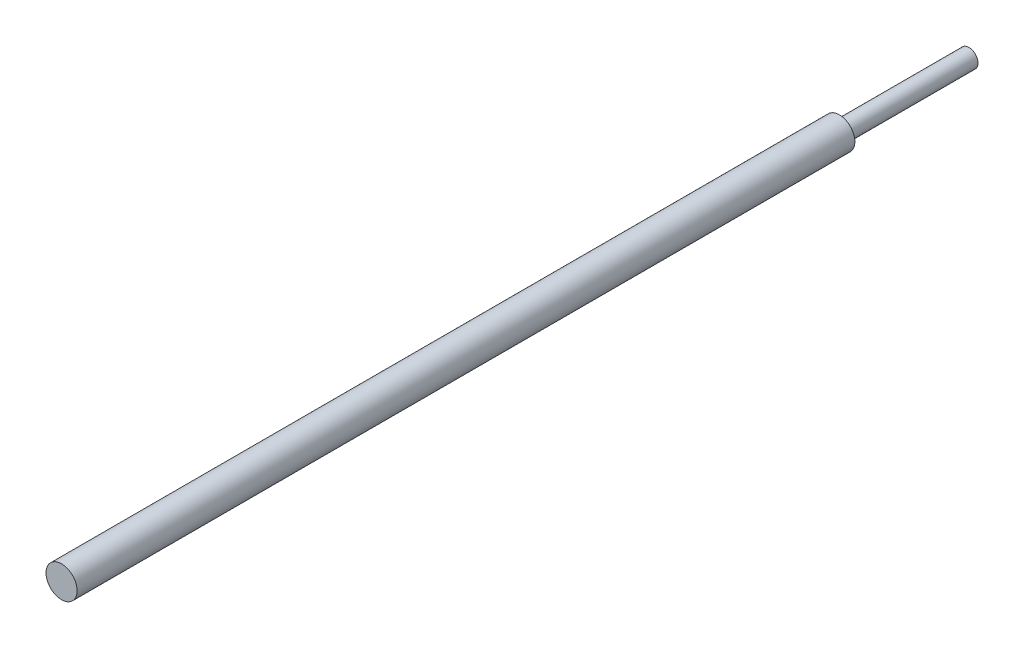
ISO-10303-21;
HEADER;
FILE_DESCRIPTION(('STEP AP214'),'2;1');
FILE_NAME('part.step','',(''),(''),'','','');
FILE_SCHEMA(('AUTOMOTIVE_DESIGN { 1 0 10303 214 1 1 1 1 }'));
ENDSEC;
DATA;
#1=APPLICATION_CONTEXT('core data for automotive mechanical design processes');
#2=APPLICATION_PROTOCOL_DEFINITION('international standard','automotive_design',2000,#1);
#3=PRODUCT_CONTEXT('',#1,'mechanical');
#4=PRODUCT('Part','Part','',(#3));
#5=PRODUCT_RELATED_PRODUCT_CATEGORY('part','',(#4));
#6=PRODUCT_DEFINITION_FORMATION('','',#4);
#7=PRODUCT_DEFINITION_CONTEXT('part definition',#1,'design');
#8=PRODUCT_DEFINITION('design','',#6,#7);
#9=PRODUCT_DEFINITION_SHAPE('','',#8);
#10=(LENGTH_UNIT() NAMED_UNIT(*) SI_UNIT(.MILLI.,.METRE.));
#11=(NAMED_UNIT(*) PLANE_ANGLE_UNIT() SI_UNIT($,.RADIAN.));
#12=(NAMED_UNIT(*) SI_UNIT($,.STERADIAN.) SOLID_ANGLE_UNIT());
#13=UNCERTAINTY_MEASURE_WITH_UNIT(LENGTH_MEASURE(1.E-05),#10,'distance_accuracy_value','');
#14=(GEOMETRIC_REPRESENTATION_CONTEXT(3) GLOBAL_UNCERTAINTY_ASSIGNED_CONTEXT((#13)) GLOBAL_UNIT_ASSIGNED_CONTEXT((#10,
#11,#12)) REPRESENTATION_CONTEXT('',''));
#15=CARTESIAN_POINT('',(0.,0.,0.));
#16=DIRECTION('',(0.,0.,1.));
#17=DIRECTION('',(1.,0.,0.));
#18=AXIS2_PLACEMENT_3D('',#15,#16,#17);
#19=CARTESIAN_POINT('',(0.,0.,4.99999999999999));
#20=DIRECTION('',(0.,0.,-1.));
#21=DIRECTION('',(-0.999999999999999,0.,0.));
#22=AXIS2_PLACEMENT_3D('',#19,#20,#21);
#23=CYLINDRICAL_SURFACE('',#22,0.35);
#24=CARTESIAN_POINT('',(0.,0.,4.99999999999999));
#25=DIRECTION('',(0.,0.,1.));
#26=DIRECTION('',(0.999999999999999,0.,0.));
#27=AXIS2_PLACEMENT_3D('',#24,#25,#26);
#28=CIRCLE('',#27,0.35);
#29=CARTESIAN_POINT('',(-0.349999999999999,0.,4.99999999999999));
#30=VERTEX_POINT('',#29);
#31=EDGE_CURVE('E10',#30,#30,#28,.T.);
#32=CARTESIAN_POINT('',(0.,0.,0.));
#33=DIRECTION('',(0.,0.,1.));
#34=DIRECTION('',(0.999999999999999,0.,0.));
#35=AXIS2_PLACEMENT_3D('',#32,#33,#34);
#36=CIRCLE('',#35,0.35);
#37=CARTESIAN_POINT('',(-0.349999999999996,0.,0.));
#38=VERTEX_POINT('',#37);
#39=EDGE_CURVE('E35',#38,#38,#36,.T.);
#40=CARTESIAN_POINT('',(-0.349999999999999,0.,4.99999999999999));
#41=CARTESIAN_POINT('',(-0.349999999999999,0.,4.94791666666666));
#42=CARTESIAN_POINT('',(-0.349999999999999,0.,4.89583333333332));
#43=CARTESIAN_POINT('',(-0.349999999999999,0.,4.79166666666666));
#44=CARTESIAN_POINT('',(-0.349999999999999,0.,4.73958333333332));
#45=CARTESIAN_POINT('',(-0.349999999999999,0.,4.63541666666666));
#46=CARTESIAN_POINT('',(-0.349999999999999,0.,4.58333333333332));
#47=CARTESIAN_POINT('',(-0.349999999999999,0.,4.47916666666666));
#48=CARTESIAN_POINT('',(-0.349999999999999,0.,4.42708333333332));
#49=CARTESIAN_POINT('',(-0.349999999999999,0.,4.32291666666666));
#50=CARTESIAN_POINT('',(-0.349999999999999,0.,4.27083333333333));
#51=CARTESIAN_POINT('',(-0.349999999999999,0.,4.16666666666666));
#52=CARTESIAN_POINT('',(-0.349999999999999,0.,4.11458333333333));
#53=CARTESIAN_POINT('',(-0.349999999999999,0.,4.01041666666666));
#54=CARTESIAN_POINT('',(-0.349999999999999,0.,3.95833333333333));
#55=CARTESIAN_POINT('',(-0.349999999999998,0.,3.85416666666666));
#56=CARTESIAN_POINT('',(-0.349999999999998,0.,3.80208333333333));
#57=CARTESIAN_POINT('',(-0.349999999999998,0.,3.69791666666666));
#58=CARTESIAN_POINT('',(-0.349999999999998,0.,3.64583333333333));
#59=CARTESIAN_POINT('',(-0.349999999999998,0.,3.54166666666666));
#60=CARTESIAN_POINT('',(-0.349999999999998,0.,3.48958333333333));
#61=CARTESIAN_POINT('',(-0.349999999999998,0.,3.38541666666666));
#62=CARTESIAN_POINT('',(-0.349999999999998,0.,3.33333333333333));
#63=CARTESIAN_POINT('',(-0.349999999999998,0.,3.22916666666666));
#64=CARTESIAN_POINT('',(-0.349999999999998,0.,3.17708333333333));
#65=CARTESIAN_POINT('',(-0.349999999999998,0.,3.07291666666666));
#66=CARTESIAN_POINT('',(-0.349999999999998,0.,3.02083333333333));
#67=CARTESIAN_POINT('',(-0.349999999999998,0.,2.91666666666666));
#68=CARTESIAN_POINT('',(-0.349999999999998,0.,2.86458333333333));
#69=CARTESIAN_POINT('',(-0.349999999999998,0.,2.76041666666666));
#70=CARTESIAN_POINT('',(-0.349999999999998,0.,2.70833333333333));
#71=CARTESIAN_POINT('',(-0.349999999999998,0.,2.60416666666666));
#72=CARTESIAN_POINT('',(-0.349999999999998,0.,2.55208333333333));
#73=CARTESIAN_POINT('',(-0.349999999999997,0.,2.44791666666666));
#74=CARTESIAN_POINT('',(-0.349999999999997,0.,2.39583333333333));
#75=CARTESIAN_POINT('',(-0.349999999999997,0.,2.29166666666666));
#76=CARTESIAN_POINT('',(-0.349999999999997,0.,2.23958333333333));
#77=CARTESIAN_POINT('',(-0.349999999999997,0.,2.13541666666666));
#78=CARTESIAN_POINT('',(-0.349999999999997,0.,2.08333333333333));
#79=CARTESIAN_POINT('',(-0.349999999999997,0.,1.97916666666666));
#80=CARTESIAN_POINT('',(-0.349999999999997,0.,1.92708333333333));
#81=CARTESIAN_POINT('',(-0.349999999999997,0.,1.82291666666666));
#82=CARTESIAN_POINT('',(-0.349999999999997,0.,1.77083333333333));
#83=CARTESIAN_POINT('',(-0.349999999999997,0.,1.66666666666666));
#84=CARTESIAN_POINT('',(-0.349999999999997,0.,1.61458333333333));
#85=CARTESIAN_POINT('',(-0.349999999999997,0.,1.51041666666666));
#86=CARTESIAN_POINT('',(-0.349999999999997,0.,1.45833333333333));
#87=CARTESIAN_POINT('',(-0.349999999999997,0.,1.35416666666666));
#88=CARTESIAN_POINT('',(-0.349999999999997,0.,1.30208333333333));
#89=CARTESIAN_POINT('',(-0.349999999999997,0.,1.19791666666666));
#90=CARTESIAN_POINT('',(-0.349999999999997,0.,1.14583333333333));
#91=CARTESIAN_POINT('',(-0.349999999999996,0.,1.04166666666666));
#92=CARTESIAN_POINT('',(-0.349999999999996,0.,0.989583333333331));
#93=CARTESIAN_POINT('',(-0.349999999999996,0.,0.885416666666664));
#94=CARTESIAN_POINT('',(-0.349999999999996,0.,0.833333333333331));
#95=CARTESIAN_POINT('',(-0.349999999999996,0.,0.729166666666664));
#96=CARTESIAN_POINT('',(-0.349999999999996,0.,0.67708333333333));
#97=CARTESIAN_POINT('',(-0.349999999999996,0.,0.572916666666664));
#98=CARTESIAN_POINT('',(-0.349999999999996,0.,0.520833333333331));
#99=CARTESIAN_POINT('',(-0.349999999999996,0.,0.416666666666664));
#100=CARTESIAN_POINT('',(-0.349999999999996,0.,0.364583333333331));
#101=CARTESIAN_POINT('',(-0.349999999999996,0.,0.260416666666665));
#102=CARTESIAN_POINT('',(-0.349999999999996,0.,0.208333333333332));
#103=CARTESIAN_POINT('',(-0.349999999999996,0.,0.104166666666665));
#104=CARTESIAN_POINT('',(-0.349999999999996,0.,0.0520833333333322));
#105=CARTESIAN_POINT('',(-0.349999999999996,0.,0.));
#106=B_SPLINE_CURVE_WITH_KNOTS('',3,(#40,#41,#42,#43,#44,#45,#46,#47,#48,#49,#50,#51,#52,#53,
#54,#55,#56,#57,#58,#59,#60,#61,#62,#63,#64,#65,#66,#67,#68,#69,#70,#71,#72,#73,#74,#75,#76,#77,
#78,#79,#80,#81,#82,#83,#84,#85,#86,#87,#88,#89,#90,#91,#92,#93,#94,#95,#96,#97,#98,#99,#100,
#101,#102,#103,#104,#105),.UNSPECIFIED.,.F.,.F.,(4,2,2,2,2,2,2,2,2,2,2,2,2,2,2,2,2,2,2,2,2,2,2,
2,2,2,2,2,2,2,2,2,4),(0.,0.156249999999999,0.312499999999999,0.468749999999999,
0.624999999999998,0.781249999999998,0.937499999999998,1.09375,1.25,1.40625,1.5625,1.71875,1.875,
2.03125,2.1875,2.34375,2.49999999999999,2.65624999999999,2.81249999999999,2.96874999999999,
3.12499999999999,3.28124999999999,3.43749999999999,3.59374999999999,3.74999999999999,
3.90624999999999,4.06249999999999,4.21874999999999,4.37499999999999,4.53124999999999,
4.68749999999999,4.84374999999999,4.99999999999999),.UNSPECIFIED.);
#107=EDGE_CURVE('BSEAM29',#30,#38,#106,.T.);
#108=ORIENTED_EDGE('',*,*,#31,.F.);
#109=ORIENTED_EDGE('',*,*,#39,.T.);
#110=ORIENTED_EDGE('',*,*,#107,.T.);
#111=ORIENTED_EDGE('',*,*,#107,.F.);
#112=EDGE_LOOP('',(#108,#110,#109,#111));
#113=FACE_BOUND('',#112,.T.);
#114=ADVANCED_FACE('F29',(#113),#23,.T.);
#115=CARTESIAN_POINT('',(0.,0.,0.));
#116=DIRECTION('',(0.,0.,1.));
#117=DIRECTION('',(0.999999999999999,0.,0.));
#118=AXIS2_PLACEMENT_3D('',#115,#116,#117);
#119=PLANE('',#118);
#120=ORIENTED_EDGE('',*,*,#39,.F.);
#121=EDGE_LOOP('',(#120));
#122=FACE_BOUND('',#121,.T.);
#123=ADVANCED_FACE('F53',(#122),#119,.F.);
#124=CARTESIAN_POINT('',(0.,0.,4.99999999999999));
#125=DIRECTION('',(0.,0.,1.));
#126=DIRECTION('',(0.999999999999999,0.,0.));
#127=AXIS2_PLACEMENT_3D('',#124,#125,#126);
#128=PLANE('',#127);
#129=CARTESIAN_POINT('',(0.,0.,4.99999999999999));
#130=DIRECTION('',(0.,0.,1.));
#131=DIRECTION('',(0.999999999999999,0.,0.));
#132=AXIS2_PLACEMENT_3D('',#129,#130,#131);
#133=CIRCLE('',#132,0.6);
#134=CARTESIAN_POINT('',(-0.600000000000006,0.,4.99999999999999));
#135=VERTEX_POINT('',#134);
#136=EDGE_CURVE('E43',#135,#135,#133,.T.);
#137=ORIENTED_EDGE('',*,*,#136,.F.);
#138=EDGE_LOOP('',(#137));
#139=FACE_BOUND('',#138,.T.);
#140=ORIENTED_EDGE('',*,*,#31,.T.);
#141=EDGE_LOOP('',(#140));
#142=FACE_BOUND('',#141,.T.);
#143=ADVANCED_FACE('F51',(#139,#142),#128,.F.);
#144=CARTESIAN_POINT('',(0.,0.,35.));
#145=DIRECTION('',(0.,0.,-1.));
#146=DIRECTION('',(-0.999999999999999,0.,0.));
#147=AXIS2_PLACEMENT_3D('',#144,#145,#146);
#148=CYLINDRICAL_SURFACE('',#147,0.6);
#149=CARTESIAN_POINT('',(0.,0.,35.));
#150=DIRECTION('',(0.,0.,1.));
#151=DIRECTION('',(0.999999999999999,0.,0.));
#152=AXIS2_PLACEMENT_3D('',#149,#150,#151);
#153=CIRCLE('',#152,0.6);
#154=CARTESIAN_POINT('',(-0.600000000000027,0.,35.));
#155=VERTEX_POINT('',#154);
#156=EDGE_CURVE('E39',#155,#155,#153,.T.);
#157=CARTESIAN_POINT('',(-0.600000000000027,0.,35.));
#158=CARTESIAN_POINT('',(-0.600000000000027,0.,34.6875));
#159=CARTESIAN_POINT('',(-0.600000000000027,0.,34.375));
#160=CARTESIAN_POINT('',(-0.600000000000026,0.,33.75));
#161=CARTESIAN_POINT('',(-0.600000000000026,0.,33.4375));
#162=CARTESIAN_POINT('',(-0.600000000000026,0.,32.8125));
#163=CARTESIAN_POINT('',(-0.600000000000025,0.,32.5));
#164=CARTESIAN_POINT('',(-0.600000000000025,0.,31.875));
#165=CARTESIAN_POINT('',(-0.600000000000025,0.,31.5625));
#166=CARTESIAN_POINT('',(-0.600000000000024,0.,30.9375));
#167=CARTESIAN_POINT('',(-0.600000000000024,0.,30.625));
#168=CARTESIAN_POINT('',(-0.600000000000024,0.,30.));
#169=CARTESIAN_POINT('',(-0.600000000000023,0.,29.6875));
#170=CARTESIAN_POINT('',(-0.600000000000023,0.,29.0625));
#171=CARTESIAN_POINT('',(-0.600000000000023,0.,28.75));
#172=CARTESIAN_POINT('',(-0.600000000000022,0.,28.125));
#173=CARTESIAN_POINT('',(-0.600000000000022,0.,27.8125));
#174=CARTESIAN_POINT('',(-0.600000000000022,0.,27.1875));
#175=CARTESIAN_POINT('',(-0.600000000000021,0.,26.875));
#176=CARTESIAN_POINT('',(-0.600000000000021,0.,26.25));
#177=CARTESIAN_POINT('',(-0.600000000000021,0.,25.9375));
#178=CARTESIAN_POINT('',(-0.60000000000002,0.,25.3125));
#179=CARTESIAN_POINT('',(-0.60000000000002,0.,25.));
#180=CARTESIAN_POINT('',(-0.60000000000002,0.,24.375));
#181=CARTESIAN_POINT('',(-0.600000000000019,0.,24.0625));
#182=CARTESIAN_POINT('',(-0.600000000000019,0.,23.4375));
#183=CARTESIAN_POINT('',(-0.600000000000019,0.,23.125));
#184=CARTESIAN_POINT('',(-0.600000000000018,0.,22.5));
#185=CARTESIAN_POINT('',(-0.600000000000018,0.,22.1875));
#186=CARTESIAN_POINT('',(-0.600000000000018,0.,21.5625));
#187=CARTESIAN_POINT('',(-0.600000000000017,0.,21.25));
#188=CARTESIAN_POINT('',(-0.600000000000017,0.,20.625));
#189=CARTESIAN_POINT('',(-0.600000000000017,0.,20.3125));
#190=CARTESIAN_POINT('',(-0.600000000000016,0.,19.6875));
#191=CARTESIAN_POINT('',(-0.600000000000016,0.,19.375));
#192=CARTESIAN_POINT('',(-0.600000000000015,0.,18.75));
#193=CARTESIAN_POINT('',(-0.600000000000015,0.,18.4375));
#194=CARTESIAN_POINT('',(-0.600000000000015,0.,17.8125));
#195=CARTESIAN_POINT('',(-0.600000000000015,0.,17.5));
#196=CARTESIAN_POINT('',(-0.600000000000014,0.,16.875));
#197=CARTESIAN_POINT('',(-0.600000000000014,0.,16.5625));
#198=CARTESIAN_POINT('',(-0.600000000000013,0.,15.9375));
#199=CARTESIAN_POINT('',(-0.600000000000013,0.,15.625));
#200=CARTESIAN_POINT('',(-0.600000000000013,0.,15.));
#201=CARTESIAN_POINT('',(-0.600000000000013,0.,14.6875));
#202=CARTESIAN_POINT('',(-0.600000000000012,0.,14.0625));
#203=CARTESIAN_POINT('',(-0.600000000000012,0.,13.75));
#204=CARTESIAN_POINT('',(-0.600000000000011,0.,13.125));
#205=CARTESIAN_POINT('',(-0.600000000000011,0.,12.8125));
#206=CARTESIAN_POINT('',(-0.600000000000011,0.,12.1875));
#207=CARTESIAN_POINT('',(-0.60000000000001,0.,11.875));
#208=CARTESIAN_POINT('',(-0.60000000000001,0.,11.25));
#209=CARTESIAN_POINT('',(-0.60000000000001,0.,10.9375));
#210=CARTESIAN_POINT('',(-0.600000000000009,0.,10.3125));
#211=CARTESIAN_POINT('',(-0.600000000000009,0.,9.99999999999999));
#212=CARTESIAN_POINT('',(-0.600000000000009,0.,9.37499999999999));
#213=CARTESIAN_POINT('',(-0.600000000000009,0.,9.06249999999999));
#214=CARTESIAN_POINT('',(-0.600000000000008,0.,8.43749999999999));
#215=CARTESIAN_POINT('',(-0.600000000000008,0.,8.12499999999999));
#216=CARTESIAN_POINT('',(-0.600000000000007,0.,7.49999999999999));
#217=CARTESIAN_POINT('',(-0.600000000000007,0.,7.18749999999999));
#218=CARTESIAN_POINT('',(-0.600000000000007,0.,6.56249999999999));
#219=CARTESIAN_POINT('',(-0.600000000000006,0.,6.24999999999999));
#220=CARTESIAN_POINT('',(-0.600000000000006,0.,5.62499999999999));
#221=CARTESIAN_POINT('',(-0.600000000000006,0.,5.31249999999999));
#222=CARTESIAN_POINT('',(-0.600000000000006,0.,4.99999999999999));
#223=B_SPLINE_CURVE_WITH_KNOTS('',3,(#157,#158,#159,#160,#161,#162,#163,#164,#165,#166,#167,
#168,#169,#170,#171,#172,#173,#174,#175,#176,#177,#178,#179,#180,#181,#182,#183,#184,#185,#186,
#187,#188,#189,#190,#191,#192,#193,#194,#195,#196,#197,#198,#199,#200,#201,#202,#203,#204,#205,
#206,#207,#208,#209,#210,#211,#212,#213,#214,#215,#216,#217,#218,#219,#220,#221,#222),
.UNSPECIFIED.,.F.,.F.,(4,2,2,2,2,2,2,2,2,2,2,2,2,2,2,2,2,2,2,2,2,2,2,2,2,2,2,2,2,2,2,2,4),(0.,
0.937500000000001,1.875,2.8125,3.75,4.6875,5.625,6.5625,7.5,8.4375,9.375,10.3125,11.25,12.1875,
13.125,14.0625,15.,15.9375,16.875,17.8125,18.75,19.6875,20.625,21.5625,22.5,23.4375,24.375,
25.3125,26.25,27.1875,28.125,29.0625,30.),.UNSPECIFIED.);
#224=EDGE_CURVE('BSEAM49',#155,#135,#223,.T.);
#225=ORIENTED_EDGE('',*,*,#156,.F.);
#226=ORIENTED_EDGE('',*,*,#136,.T.);
#227=ORIENTED_EDGE('',*,*,#224,.T.);
#228=ORIENTED_EDGE('',*,*,#224,.F.);
#229=EDGE_LOOP('',(#225,#227,#226,#228));
#230=FACE_BOUND('',#229,.T.);
#231=ADVANCED_FACE('F49',(#230),#148,.T.);
#232=CARTESIAN_POINT('',(0.,0.,35.));
#233=DIRECTION('',(0.,0.,1.));
#234=DIRECTION('',(0.999999999999999,0.,0.));
#235=AXIS2_PLACEMENT_3D('',#232,#233,#234);
#236=PLANE('',#235);
#237=ORIENTED_EDGE('',*,*,#156,.T.);
#238=EDGE_LOOP('',(#237));
#239=FACE_BOUND('',#238,.T.);
#240=ADVANCED_FACE('F59',(#239),#236,.T.);
#241=CLOSED_SHELL('',(#114,#123,#143,#231,#240));
#242=MANIFOLD_SOLID_BREP('B2',#241);
#243=ADVANCED_BREP_SHAPE_REPRESENTATION('',(#18,#242),#14);
#244=SHAPE_DEFINITION_REPRESENTATION(#9,#243);
ENDSEC;
END-ISO-10303-21;
